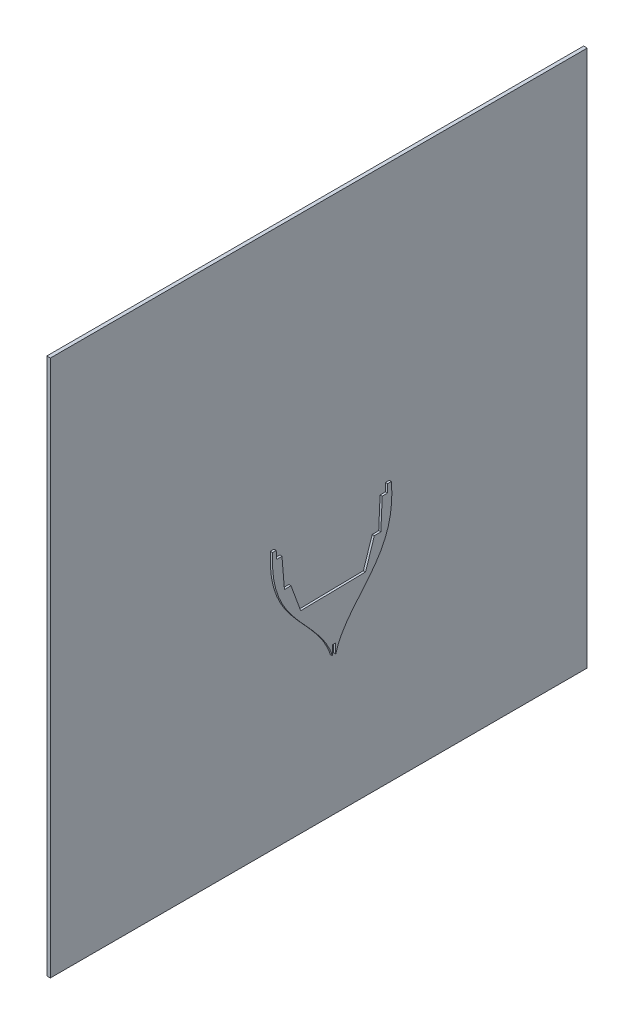
ISO-10303-21;
HEADER;
FILE_DESCRIPTION(('STEP AP214'),'2;1');
FILE_NAME('part.step','',(''),(''),'','','');
FILE_SCHEMA(('AUTOMOTIVE_DESIGN { 1 0 10303 214 1 1 1 1 }'));
ENDSEC;
DATA;
#1=APPLICATION_CONTEXT('core data for automotive mechanical design processes');
#2=APPLICATION_PROTOCOL_DEFINITION('international standard','automotive_design',2000,#1);
#3=PRODUCT_CONTEXT('',#1,'mechanical');
#4=PRODUCT('Part','Part','',(#3));
#5=PRODUCT_RELATED_PRODUCT_CATEGORY('part','',(#4));
#6=PRODUCT_DEFINITION_FORMATION('','',#4);
#7=PRODUCT_DEFINITION_CONTEXT('part definition',#1,'design');
#8=PRODUCT_DEFINITION('design','',#6,#7);
#9=PRODUCT_DEFINITION_SHAPE('','',#8);
#10=(LENGTH_UNIT() NAMED_UNIT(*) SI_UNIT(.MILLI.,.METRE.));
#11=(NAMED_UNIT(*) PLANE_ANGLE_UNIT() SI_UNIT($,.RADIAN.));
#12=(NAMED_UNIT(*) SI_UNIT($,.STERADIAN.) SOLID_ANGLE_UNIT());
#13=UNCERTAINTY_MEASURE_WITH_UNIT(LENGTH_MEASURE(1.E-05),#10,'distance_accuracy_value','');
#14=(GEOMETRIC_REPRESENTATION_CONTEXT(3) GLOBAL_UNCERTAINTY_ASSIGNED_CONTEXT((#13)) GLOBAL_UNIT_ASSIGNED_CONTEXT((#10,
#11,#12)) REPRESENTATION_CONTEXT('',''));
#15=CARTESIAN_POINT('',(0.,0.,0.));
#16=DIRECTION('',(0.,0.,1.));
#17=DIRECTION('',(1.,0.,0.));
#18=AXIS2_PLACEMENT_3D('',#15,#16,#17);
#19=CARTESIAN_POINT('',(6.,356.280633701159,172.379508382561));
#20=CARTESIAN_POINT('',(6.,148.736056380955,183.782555695277));
#21=CARTESIAN_POINT('',(6.,145.183117288321,33.5618458108781));
#22=CARTESIAN_POINT('',(6.,34.0320108089214,4.00706777772326));
#23=CARTESIAN_POINT('',(6.,0.,0.));
#24=B_SPLINE_CURVE_WITH_KNOTS('',4,(#19,#20,#21,#22,#23),.UNSPECIFIED.,.F.,.F.,(5,5),(0.,1.),.UNSPECIFIED.);
#25=DIRECTION('',(-1.,0.,0.));
#26=VECTOR('',#25,1.);
#27=SURFACE_OF_LINEAR_EXTRUSION('',#24,#26);
#28=CARTESIAN_POINT('',(0.,356.280633701159,172.379508382561));
#29=CARTESIAN_POINT('',(0.,148.736056380955,183.782555695277));
#30=CARTESIAN_POINT('',(0.,145.183117288321,33.5618458108781));
#31=CARTESIAN_POINT('',(0.,34.0320108089214,4.00706777772326));
#32=CARTESIAN_POINT('',(0.,0.,0.));
#33=B_SPLINE_CURVE_WITH_KNOTS('',4,(#28,#29,#30,#31,#32),.UNSPECIFIED.,.F.,.F.,(5,5),(0.,1.),.UNSPECIFIED.);
#34=CARTESIAN_POINT('',(0.,356.280633701159,172.379508382561));
#35=VERTEX_POINT('',#34);
#36=CARTESIAN_POINT('',(0.,22.4711291041874,4.90854973210714));
#37=VERTEX_POINT('',#36);
#38=EDGE_CURVE('E191',#35,#37,#33,.T.);
#39=ORIENTED_EDGE('',*,*,#38,.T.);
#40=DIRECTION('',(1.,0.,0.));
#41=VECTOR('',#40,1.);
#42=CARTESIAN_POINT('',(0.,22.4711291041874,4.90854973210714));
#43=LINE('',#42,#41);
#44=CARTESIAN_POINT('',(6.,22.4711291041874,4.90854973210714));
#45=VERTEX_POINT('',#44);
#46=EDGE_CURVE('E197',#37,#45,#43,.T.);
#47=ORIENTED_EDGE('',*,*,#46,.T.);
#48=CARTESIAN_POINT('',(6.,356.280633701159,172.379508382561));
#49=VERTEX_POINT('',#48);
#50=EDGE_CURVE('E231',#49,#45,#24,.T.);
#51=ORIENTED_EDGE('',*,*,#50,.F.);
#52=DIRECTION('',(-1.,0.,0.));
#53=VECTOR('',#52,1.);
#54=CARTESIAN_POINT('',(6.,356.280633701159,172.379508382561));
#55=LINE('',#54,#53);
#56=EDGE_CURVE('E187',#49,#35,#55,.T.);
#57=ORIENTED_EDGE('',*,*,#56,.T.);
#58=EDGE_LOOP('',(#39,#47,#51,#57));
#59=FACE_BOUND('',#58,.T.);
#60=ADVANCED_FACE('F45',(#59),#27,.F.);
#61=CARTESIAN_POINT('',(6.,0.,0.));
#62=CARTESIAN_POINT('',(6.,34.1548132396876,-2.77183773620876));
#63=CARTESIAN_POINT('',(6.,146.303432049568,-28.2814570046344));
#64=CARTESIAN_POINT('',(6.,155.294864157255,-178.274920872303));
#65=CARTESIAN_POINT('',(6.,362.290262173808,-159.362325518756));
#66=B_SPLINE_CURVE_WITH_KNOTS('',4,(#61,#62,#63,#64,#65),.UNSPECIFIED.,.F.,.F.,(5,5),(0.,1.),.UNSPECIFIED.);
#67=DIRECTION('',(-1.,0.,0.));
#68=VECTOR('',#67,1.);
#69=SURFACE_OF_LINEAR_EXTRUSION('',#66,#68);
#70=CARTESIAN_POINT('',(6.,22.6341674994895,-4.09145026789286));
#71=VERTEX_POINT('',#70);
#72=CARTESIAN_POINT('',(6.,362.290262173808,-159.362325518756));
#73=VERTEX_POINT('',#72);
#74=EDGE_CURVE('E128',#71,#73,#66,.T.);
#75=ORIENTED_EDGE('',*,*,#74,.F.);
#76=DIRECTION('',(1.,0.,0.));
#77=VECTOR('',#76,1.);
#78=CARTESIAN_POINT('',(0.,22.6341674994895,-4.09145026789286));
#79=LINE('',#78,#77);
#80=CARTESIAN_POINT('',(0.,22.6341674994895,-4.09145026789286));
#81=VERTEX_POINT('',#80);
#82=EDGE_CURVE('E323',#81,#71,#79,.T.);
#83=ORIENTED_EDGE('',*,*,#82,.F.);
#84=CARTESIAN_POINT('',(0.,0.,0.));
#85=CARTESIAN_POINT('',(0.,34.1548132396876,-2.77183773620876));
#86=CARTESIAN_POINT('',(0.,146.303432049568,-28.2814570046344));
#87=CARTESIAN_POINT('',(0.,155.294864157255,-178.274920872303));
#88=CARTESIAN_POINT('',(0.,362.290262173808,-159.362325518756));
#89=B_SPLINE_CURVE_WITH_KNOTS('',4,(#84,#85,#86,#87,#88),.UNSPECIFIED.,.F.,.F.,(5,5),(0.,1.),.UNSPECIFIED.);
#90=CARTESIAN_POINT('',(0.,362.290262173808,-159.362325518756));
#91=VERTEX_POINT('',#90);
#92=EDGE_CURVE('E196',#81,#91,#89,.T.);
#93=ORIENTED_EDGE('',*,*,#92,.T.);
#94=DIRECTION('',(-1.,0.,0.));
#95=VECTOR('',#94,1.);
#96=CARTESIAN_POINT('',(6.,362.290262173808,-159.362325518756));
#97=LINE('',#96,#95);
#98=EDGE_CURVE('E13',#73,#91,#97,.T.);
#99=ORIENTED_EDGE('',*,*,#98,.F.);
#100=EDGE_LOOP('',(#75,#83,#93,#99));
#101=FACE_BOUND('',#100,.T.);
#102=ADVANCED_FACE('F335',(#101),#69,.F.);
#103=CARTESIAN_POINT('',(6.,362.290262173808,-159.362325518756));
#104=DIRECTION('',(0.,-0.999835956927465,-0.0181124055536444));
#105=DIRECTION('',(0.,0.0181124055536444,-0.999835956927465));
#106=AXIS2_PLACEMENT_3D('',#103,#104,#105);
#107=PLANE('',#106);
#108=DIRECTION('',(0.,-0.0181124055536444,0.999835956927465));
#109=VECTOR('',#108,1.);
#110=CARTESIAN_POINT('',(0.,362.290262173808,-159.362325518756));
#111=LINE('',#110,#109);
#112=CARTESIAN_POINT('',(0.,362.10910840125,-149.362325518756));
#113=VERTEX_POINT('',#112);
#114=EDGE_CURVE('E204',#91,#113,#111,.T.);
#115=ORIENTED_EDGE('',*,*,#114,.T.);
#116=DIRECTION('',(-1.,0.,0.));
#117=VECTOR('',#116,1.);
#118=CARTESIAN_POINT('',(6.,362.10910840125,-149.362325518756));
#119=LINE('',#118,#117);
#120=CARTESIAN_POINT('',(6.,362.10910840125,-149.362325518756));
#121=VERTEX_POINT('',#120);
#122=EDGE_CURVE('E53',#121,#113,#119,.T.);
#123=ORIENTED_EDGE('',*,*,#122,.F.);
#124=DIRECTION('',(0.,-0.0181124055536444,0.999835956927465));
#125=VECTOR('',#124,1.);
#126=CARTESIAN_POINT('',(6.,362.290262173808,-159.362325518756));
#127=LINE('',#126,#125);
#128=EDGE_CURVE('E317',#73,#121,#127,.T.);
#129=ORIENTED_EDGE('',*,*,#128,.F.);
#130=ORIENTED_EDGE('',*,*,#98,.T.);
#131=EDGE_LOOP('',(#115,#123,#129,#130));
#132=FACE_BOUND('',#131,.T.);
#133=ADVANCED_FACE('F338',(#132),#107,.F.);
#134=CARTESIAN_POINT('',(6.,362.10910840125,-149.362325518756));
#135=DIRECTION('',(0.,-0.0391741395667259,-0.999232398788794));
#136=DIRECTION('',(0.,0.999232398788794,-0.039174139566726));
#137=AXIS2_PLACEMENT_3D('',#134,#135,#136);
#138=PLANE('',#137);
#139=DIRECTION('',(0.,-0.999232398788794,0.039174139566726));
#140=VECTOR('',#139,1.);
#141=CARTESIAN_POINT('',(0.,362.10910840125,-149.362325518756));
#142=LINE('',#141,#140);
#143=CARTESIAN_POINT('',(0.,339.534200842604,-148.477293587765));
#144=VERTEX_POINT('',#143);
#145=EDGE_CURVE('E209',#113,#144,#142,.T.);
#146=ORIENTED_EDGE('',*,*,#145,.T.);
#147=DIRECTION('',(-1.,0.,0.));
#148=VECTOR('',#147,1.);
#149=CARTESIAN_POINT('',(6.,339.534200842604,-148.477293587765));
#150=LINE('',#149,#148);
#151=CARTESIAN_POINT('',(6.,339.534200842604,-148.477293587765));
#152=VERTEX_POINT('',#151);
#153=EDGE_CURVE('E256',#152,#144,#150,.T.);
#154=ORIENTED_EDGE('',*,*,#153,.F.);
#155=DIRECTION('',(0.,-0.999232398788794,0.039174139566726));
#156=VECTOR('',#155,1.);
#157=CARTESIAN_POINT('',(6.,362.10910840125,-149.362325518756));
#158=LINE('',#157,#156);
#159=EDGE_CURVE('E265',#121,#152,#158,.T.);
#160=ORIENTED_EDGE('',*,*,#159,.F.);
#161=ORIENTED_EDGE('',*,*,#122,.T.);
#162=EDGE_LOOP('',(#146,#154,#160,#161));
#163=FACE_BOUND('',#162,.T.);
#164=ADVANCED_FACE('F263',(#163),#138,.F.);
#165=CARTESIAN_POINT('',(6.,339.534200842604,-148.477293587765));
#166=DIRECTION('',(0.,-0.999835956927465,-0.0181124055536422));
#167=DIRECTION('',(0.,0.0181124055536422,-0.999835956927466));
#168=AXIS2_PLACEMENT_3D('',#165,#166,#167);
#169=PLANE('',#168);
#170=DIRECTION('',(0.,-0.0181124055536422,0.999835956927466));
#171=VECTOR('',#170,1.);
#172=CARTESIAN_POINT('',(0.,339.534200842604,-148.477293587765));
#173=LINE('',#172,#171);
#174=CARTESIAN_POINT('',(0.,339.270932093817,-133.944405584924));
#175=VERTEX_POINT('',#174);
#176=EDGE_CURVE('E211',#144,#175,#173,.T.);
#177=ORIENTED_EDGE('',*,*,#176,.T.);
#178=DIRECTION('',(-1.,0.,0.));
#179=VECTOR('',#178,1.);
#180=CARTESIAN_POINT('',(6.,339.270932093817,-133.944405584924));
#181=LINE('',#180,#179);
#182=CARTESIAN_POINT('',(6.,339.270932093817,-133.944405584924));
#183=VERTEX_POINT('',#182);
#184=EDGE_CURVE('E253',#183,#175,#181,.T.);
#185=ORIENTED_EDGE('',*,*,#184,.F.);
#186=DIRECTION('',(0.,-0.0181124055536422,0.999835956927466));
#187=VECTOR('',#186,1.);
#188=CARTESIAN_POINT('',(6.,339.534200842604,-148.477293587765));
#189=LINE('',#188,#187);
#190=EDGE_CURVE('E287',#152,#183,#189,.T.);
#191=ORIENTED_EDGE('',*,*,#190,.F.);
#192=ORIENTED_EDGE('',*,*,#153,.T.);
#193=EDGE_LOOP('',(#177,#185,#191,#192));
#194=FACE_BOUND('',#193,.T.);
#195=ADVANCED_FACE('F278',(#194),#169,.F.);
#196=CARTESIAN_POINT('',(6.,339.270932093817,-133.944405584924));
#197=DIRECTION('',(0.,-0.0452782812916506,-0.998974412706989));
#198=DIRECTION('',(0.,0.998974412706989,-0.0452782812916506));
#199=AXIS2_PLACEMENT_3D('',#196,#197,#198);
#200=PLANE('',#199);
#201=DIRECTION('',(0.,-0.998974412706989,0.0452782812916506));
#202=VECTOR('',#201,1.);
#203=CARTESIAN_POINT('',(0.,339.270932093817,-133.944405584924));
#204=LINE('',#203,#202);
#205=CARTESIAN_POINT('',(0.,254.978494084232,-130.123870573808));
#206=VERTEX_POINT('',#205);
#207=EDGE_CURVE('E213',#175,#206,#204,.T.);
#208=ORIENTED_EDGE('',*,*,#207,.T.);
#209=DIRECTION('',(-1.,0.,0.));
#210=VECTOR('',#209,1.);
#211=CARTESIAN_POINT('',(6.,254.978494084232,-130.123870573808));
#212=LINE('',#211,#210);
#213=CARTESIAN_POINT('',(6.,254.978494084232,-130.123870573808));
#214=VERTEX_POINT('',#213);
#215=EDGE_CURVE('E250',#214,#206,#212,.T.);
#216=ORIENTED_EDGE('',*,*,#215,.F.);
#217=DIRECTION('',(0.,-0.998974412706989,0.0452782812916506));
#218=VECTOR('',#217,1.);
#219=CARTESIAN_POINT('',(6.,339.270932093817,-133.944405584924));
#220=LINE('',#219,#218);
#221=EDGE_CURVE('E284',#183,#214,#220,.T.);
#222=ORIENTED_EDGE('',*,*,#221,.F.);
#223=ORIENTED_EDGE('',*,*,#184,.T.);
#224=EDGE_LOOP('',(#208,#216,#222,#223));
#225=FACE_BOUND('',#224,.T.);
#226=ADVANCED_FACE('F282',(#225),#200,.F.);
#227=CARTESIAN_POINT('',(6.,254.978494084232,-130.123870573808));
#228=DIRECTION('',(0.,-0.999835956927465,-0.0181124055536477));
#229=DIRECTION('',(0.,0.0181124055536477,-0.999835956927465));
#230=AXIS2_PLACEMENT_3D('',#227,#228,#229);
#231=PLANE('',#230);
#232=DIRECTION('',(0.,-0.0181124055536477,0.999835956927465));
#233=VECTOR('',#232,1.);
#234=CARTESIAN_POINT('',(0.,254.978494084232,-130.123870573808));
#235=LINE('',#234,#233);
#236=CARTESIAN_POINT('',(0.,254.648375911079,-111.900779302144));
#237=VERTEX_POINT('',#236);
#238=EDGE_CURVE('E215',#206,#237,#235,.T.);
#239=ORIENTED_EDGE('',*,*,#238,.T.);
#240=DIRECTION('',(-1.,0.,0.));
#241=VECTOR('',#240,1.);
#242=CARTESIAN_POINT('',(6.,254.648375911079,-111.900779302144));
#243=LINE('',#242,#241);
#244=CARTESIAN_POINT('',(6.,254.648375911079,-111.900779302144));
#245=VERTEX_POINT('',#244);
#246=EDGE_CURVE('E247',#245,#237,#243,.T.);
#247=ORIENTED_EDGE('',*,*,#246,.F.);
#248=DIRECTION('',(0.,-0.0181124055536477,0.999835956927465));
#249=VECTOR('',#248,1.);
#250=CARTESIAN_POINT('',(6.,254.978494084232,-130.123870573808));
#251=LINE('',#250,#249);
#252=EDGE_CURVE('E286',#214,#245,#251,.T.);
#253=ORIENTED_EDGE('',*,*,#252,.F.);
#254=ORIENTED_EDGE('',*,*,#215,.T.);
#255=EDGE_LOOP('',(#239,#247,#253,#254));
#256=FACE_BOUND('',#255,.T.);
#257=ADVANCED_FACE('F348',(#256),#231,.F.);
#258=CARTESIAN_POINT('',(6.,254.648375911079,-111.900779302144));
#259=DIRECTION('',(0.,-0.310187541661781,-0.950675385711559));
#260=DIRECTION('',(0.,0.950675385711559,-0.310187541661781));
#261=AXIS2_PLACEMENT_3D('',#258,#259,#260);
#262=PLANE('',#261);
#263=DIRECTION('',(0.,-0.950675385711559,0.310187541661781));
#264=VECTOR('',#263,1.);
#265=CARTESIAN_POINT('',(0.,254.648375911079,-111.900779302144));
#266=LINE('',#265,#264);
#267=CARTESIAN_POINT('',(0.,179.44082544892,-87.361966640238));
#268=VERTEX_POINT('',#267);
#269=EDGE_CURVE('E217',#237,#268,#266,.T.);
#270=ORIENTED_EDGE('',*,*,#269,.T.);
#271=DIRECTION('',(-1.,0.,0.));
#272=VECTOR('',#271,1.);
#273=CARTESIAN_POINT('',(6.,179.44082544892,-87.361966640238));
#274=LINE('',#273,#272);
#275=CARTESIAN_POINT('',(6.,179.44082544892,-87.361966640238));
#276=VERTEX_POINT('',#275);
#277=EDGE_CURVE('E244',#276,#268,#274,.T.);
#278=ORIENTED_EDGE('',*,*,#277,.F.);
#279=DIRECTION('',(0.,-0.950675385711559,0.310187541661781));
#280=VECTOR('',#279,1.);
#281=CARTESIAN_POINT('',(6.,254.648375911079,-111.900779302144));
#282=LINE('',#281,#280);
#283=EDGE_CURVE('E289',#245,#276,#282,.T.);
#284=ORIENTED_EDGE('',*,*,#283,.F.);
#285=ORIENTED_EDGE('',*,*,#246,.T.);
#286=EDGE_LOOP('',(#270,#278,#284,#285));
#287=FACE_BOUND('',#286,.T.);
#288=ADVANCED_FACE('F351',(#287),#262,.F.);
#289=CARTESIAN_POINT('',(6.,179.44082544892,-87.361966640238));
#290=DIRECTION('',(0.,-0.999835956927465,-0.0181124055536431));
#291=DIRECTION('',(0.,0.0181124055536431,-0.999835956927466));
#292=AXIS2_PLACEMENT_3D('',#289,#290,#291);
#293=PLANE('',#292);
#294=DIRECTION('',(0.,-0.0181124055536431,0.999835956927465));
#295=VECTOR('',#294,1.);
#296=CARTESIAN_POINT('',(0.,179.44082544892,-87.361966640238));
#297=LINE('',#296,#295);
#298=CARTESIAN_POINT('',(0.,176.158939411901,93.8037905327611));
#299=VERTEX_POINT('',#298);
#300=EDGE_CURVE('E219',#268,#299,#297,.T.);
#301=ORIENTED_EDGE('',*,*,#300,.T.);
#302=DIRECTION('',(-1.,0.,0.));
#303=VECTOR('',#302,1.);
#304=CARTESIAN_POINT('',(6.,176.158939411901,93.8037905327611));
#305=LINE('',#304,#303);
#306=CARTESIAN_POINT('',(6.,176.158939411901,93.8037905327611));
#307=VERTEX_POINT('',#306);
#308=EDGE_CURVE('E241',#307,#299,#305,.T.);
#309=ORIENTED_EDGE('',*,*,#308,.F.);
#310=DIRECTION('',(0.,-0.0181124055536431,0.999835956927465));
#311=VECTOR('',#310,1.);
#312=CARTESIAN_POINT('',(6.,179.44082544892,-87.361966640238));
#313=LINE('',#312,#311);
#314=EDGE_CURVE('E295',#276,#307,#313,.T.);
#315=ORIENTED_EDGE('',*,*,#314,.F.);
#316=ORIENTED_EDGE('',*,*,#277,.T.);
#317=EDGE_LOOP('',(#301,#309,#315,#316));
#318=FACE_BOUND('',#317,.T.);
#319=ADVANCED_FACE('F355',(#318),#293,.F.);
#320=CARTESIAN_POINT('',(6.,250.428376777812,121.050435220232));
#321=DIRECTION('',(0.,-0.344416408837037,0.938816988195143));
#322=DIRECTION('',(0.,-0.938816988195143,-0.344416408837037));
#323=AXIS2_PLACEMENT_3D('',#320,#321,#322);
#324=PLANE('',#323);
#325=DIRECTION('',(0.,0.938816988195143,0.344416408837036));
#326=VECTOR('',#325,1.);
#327=CARTESIAN_POINT('',(0.,250.428376777812,121.050435220232));
#328=LINE('',#327,#326);
#329=CARTESIAN_POINT('',(0.,250.428376777812,121.050435220232));
#330=VERTEX_POINT('',#329);
#331=EDGE_CURVE('E221',#299,#330,#328,.T.);
#332=ORIENTED_EDGE('',*,*,#331,.T.);
#333=DIRECTION('',(-1.,0.,0.));
#334=VECTOR('',#333,1.);
#335=CARTESIAN_POINT('',(6.,250.428376777812,121.050435220232));
#336=LINE('',#335,#334);
#337=CARTESIAN_POINT('',(6.,250.428376777812,121.050435220232));
#338=VERTEX_POINT('',#337);
#339=EDGE_CURVE('E238',#338,#330,#336,.T.);
#340=ORIENTED_EDGE('',*,*,#339,.F.);
#341=DIRECTION('',(0.,0.938816988195143,0.344416408837036));
#342=VECTOR('',#341,1.);
#343=CARTESIAN_POINT('',(6.,250.428376777812,121.050435220232));
#344=LINE('',#343,#342);
#345=EDGE_CURVE('E297',#307,#338,#344,.T.);
#346=ORIENTED_EDGE('',*,*,#345,.F.);
#347=ORIENTED_EDGE('',*,*,#308,.T.);
#348=EDGE_LOOP('',(#332,#340,#346,#347));
#349=FACE_BOUND('',#348,.T.);
#350=ADVANCED_FACE('F359',(#349),#324,.F.);
#351=CARTESIAN_POINT('',(6.,250.098258604659,139.273526491895));
#352=DIRECTION('',(0.,-0.999835956927465,-0.0181124055536446));
#353=DIRECTION('',(0.,0.0181124055536446,-0.999835956927465));
#354=AXIS2_PLACEMENT_3D('',#351,#352,#353);
#355=PLANE('',#354);
#356=DIRECTION('',(0.,-0.0181124055536446,0.999835956927465));
#357=VECTOR('',#356,1.);
#358=CARTESIAN_POINT('',(0.,250.098258604659,139.273526491895));
#359=LINE('',#358,#357);
#360=CARTESIAN_POINT('',(0.,250.098258604659,139.273526491895));
#361=VERTEX_POINT('',#360);
#362=EDGE_CURVE('E223',#330,#361,#359,.T.);
#363=ORIENTED_EDGE('',*,*,#362,.T.);
#364=DIRECTION('',(-1.,0.,0.));
#365=VECTOR('',#364,1.);
#366=CARTESIAN_POINT('',(6.,250.098258604659,139.273526491895));
#367=LINE('',#366,#365);
#368=CARTESIAN_POINT('',(6.,250.098258604659,139.273526491895));
#369=VERTEX_POINT('',#368);
#370=EDGE_CURVE('E235',#369,#361,#367,.T.);
#371=ORIENTED_EDGE('',*,*,#370,.F.);
#372=DIRECTION('',(0.,-0.0181124055536446,0.999835956927465));
#373=VECTOR('',#372,1.);
#374=CARTESIAN_POINT('',(6.,250.098258604659,139.273526491895));
#375=LINE('',#374,#373);
#376=EDGE_CURVE('E299',#338,#369,#375,.T.);
#377=ORIENTED_EDGE('',*,*,#376,.F.);
#378=ORIENTED_EDGE('',*,*,#339,.T.);
#379=EDGE_LOOP('',(#363,#371,#377,#378));
#380=FACE_BOUND('',#379,.T.);
#381=ADVANCED_FACE('F305',(#380),#355,.F.);
#382=CARTESIAN_POINT('',(6.,334.197015332948,146.144531522241));
#383=DIRECTION('',(0.,-0.0814302964414967,0.996679039019809));
#384=DIRECTION('',(0.,-0.996679039019809,-0.0814302964414967));
#385=AXIS2_PLACEMENT_3D('',#382,#383,#384);
#386=PLANE('',#385);
#387=DIRECTION('',(0.,0.996679039019809,0.0814302964414967));
#388=VECTOR('',#387,1.);
#389=CARTESIAN_POINT('',(0.,334.197015332948,146.144531522241));
#390=LINE('',#389,#388);
#391=CARTESIAN_POINT('',(0.,334.197015332948,146.144531522241));
#392=VERTEX_POINT('',#391);
#393=EDGE_CURVE('E225',#361,#392,#390,.T.);
#394=ORIENTED_EDGE('',*,*,#393,.T.);
#395=DIRECTION('',(-1.,0.,0.));
#396=VECTOR('',#395,1.);
#397=CARTESIAN_POINT('',(6.,334.197015332948,146.144531522241));
#398=LINE('',#397,#396);
#399=CARTESIAN_POINT('',(6.,334.197015332948,146.144531522241));
#400=VERTEX_POINT('',#399);
#401=EDGE_CURVE('E182',#400,#392,#398,.T.);
#402=ORIENTED_EDGE('',*,*,#401,.F.);
#403=DIRECTION('',(0.,0.996679039019809,0.0814302964414967));
#404=VECTOR('',#403,1.);
#405=CARTESIAN_POINT('',(6.,334.197015332948,146.144531522241));
#406=LINE('',#405,#404);
#407=EDGE_CURVE('E170',#369,#400,#406,.T.);
#408=ORIENTED_EDGE('',*,*,#407,.F.);
#409=ORIENTED_EDGE('',*,*,#370,.T.);
#410=EDGE_LOOP('',(#394,#402,#408,#409));
#411=FACE_BOUND('',#410,.T.);
#412=ADVANCED_FACE('F309',(#411),#386,.F.);
#413=CARTESIAN_POINT('',(6.,333.93374658416,160.677419525082));
#414=DIRECTION('',(0.,-0.999835956927465,-0.0181124055536422));
#415=DIRECTION('',(0.,0.0181124055536422,-0.999835956927466));
#416=AXIS2_PLACEMENT_3D('',#413,#414,#415);
#417=PLANE('',#416);
#418=DIRECTION('',(0.,-0.0181124055536422,0.999835956927466));
#419=VECTOR('',#418,1.);
#420=CARTESIAN_POINT('',(0.,333.93374658416,160.677419525082));
#421=LINE('',#420,#419);
#422=CARTESIAN_POINT('',(0.,333.93374658416,160.677419525082));
#423=VERTEX_POINT('',#422);
#424=EDGE_CURVE('E179',#392,#423,#421,.T.);
#425=ORIENTED_EDGE('',*,*,#424,.T.);
#426=DIRECTION('',(-1.,0.,0.));
#427=VECTOR('',#426,1.);
#428=CARTESIAN_POINT('',(6.,333.93374658416,160.677419525082));
#429=LINE('',#428,#427);
#430=CARTESIAN_POINT('',(6.,333.93374658416,160.677419525082));
#431=VERTEX_POINT('',#430);
#432=EDGE_CURVE('E176',#431,#423,#429,.T.);
#433=ORIENTED_EDGE('',*,*,#432,.F.);
#434=DIRECTION('',(0.,-0.0181124055536422,0.999835956927466));
#435=VECTOR('',#434,1.);
#436=CARTESIAN_POINT('',(6.,333.93374658416,160.677419525082));
#437=LINE('',#436,#435);
#438=EDGE_CURVE('E163',#400,#431,#437,.T.);
#439=ORIENTED_EDGE('',*,*,#438,.F.);
#440=ORIENTED_EDGE('',*,*,#401,.T.);
#441=EDGE_LOOP('',(#425,#433,#439,#440));
#442=FACE_BOUND('',#441,.T.);
#443=ADVANCED_FACE('F177',(#442),#417,.F.);
#444=CARTESIAN_POINT('',(6.,356.461787473717,162.379508382561));
#445=DIRECTION('',(0.,-0.0753395037207183,0.997157940939707));
#446=DIRECTION('',(0.,-0.997157940939707,-0.0753395037207183));
#447=AXIS2_PLACEMENT_3D('',#444,#445,#446);
#448=PLANE('',#447);
#449=DIRECTION('',(0.,0.997157940939707,0.0753395037207183));
#450=VECTOR('',#449,1.);
#451=CARTESIAN_POINT('',(0.,356.461787473717,162.379508382561));
#452=LINE('',#451,#450);
#453=CARTESIAN_POINT('',(0.,356.461787473717,162.379508382561));
#454=VERTEX_POINT('',#453);
#455=EDGE_CURVE('E228',#423,#454,#452,.T.);
#456=ORIENTED_EDGE('',*,*,#455,.T.);
#457=DIRECTION('',(-1.,0.,0.));
#458=VECTOR('',#457,1.);
#459=CARTESIAN_POINT('',(6.,356.461787473717,162.379508382561));
#460=LINE('',#459,#458);
#461=CARTESIAN_POINT('',(6.,356.461787473717,162.379508382561));
#462=VERTEX_POINT('',#461);
#463=EDGE_CURVE('E183',#462,#454,#460,.T.);
#464=ORIENTED_EDGE('',*,*,#463,.F.);
#465=DIRECTION('',(0.,0.997157940939707,0.0753395037207183));
#466=VECTOR('',#465,1.);
#467=CARTESIAN_POINT('',(6.,356.461787473717,162.379508382561));
#468=LINE('',#467,#466);
#469=EDGE_CURVE('E167',#431,#462,#468,.T.);
#470=ORIENTED_EDGE('',*,*,#469,.F.);
#471=ORIENTED_EDGE('',*,*,#432,.T.);
#472=EDGE_LOOP('',(#456,#464,#470,#471));
#473=FACE_BOUND('',#472,.T.);
#474=ADVANCED_FACE('F185',(#473),#448,.F.);
#475=CARTESIAN_POINT('',(6.,356.280633701159,172.379508382561));
#476=DIRECTION('',(0.,-0.999835956927465,-0.0181124055536389));
#477=DIRECTION('',(0.,0.0181124055536389,-0.999835956927465));
#478=AXIS2_PLACEMENT_3D('',#475,#476,#477);
#479=PLANE('',#478);
#480=DIRECTION('',(0.,-0.0181124055536389,0.999835956927465));
#481=VECTOR('',#480,1.);
#482=CARTESIAN_POINT('',(0.,356.280633701159,172.379508382561));
#483=LINE('',#482,#481);
#484=EDGE_CURVE('E120',#454,#35,#483,.T.);
#485=ORIENTED_EDGE('',*,*,#484,.T.);
#486=ORIENTED_EDGE('',*,*,#56,.F.);
#487=DIRECTION('',(0.,-0.0181124055536389,0.999835956927465));
#488=VECTOR('',#487,1.);
#489=CARTESIAN_POINT('',(6.,356.280633701159,172.379508382561));
#490=LINE('',#489,#488);
#491=EDGE_CURVE('E69',#462,#49,#490,.T.);
#492=ORIENTED_EDGE('',*,*,#491,.F.);
#493=ORIENTED_EDGE('',*,*,#463,.T.);
#494=EDGE_LOOP('',(#485,#486,#492,#493));
#495=FACE_BOUND('',#494,.T.);
#496=ADVANCED_FACE('F311',(#495),#479,.F.);
#497=CARTESIAN_POINT('',(6.,122.403225386912,70.3068173212395));
#498=DIRECTION('',(-1.,0.,0.));
#499=DIRECTION('',(0.,0.,1.));
#500=AXIS2_PLACEMENT_3D('',#497,#498,#499);
#501=PLANE('',#500);
#502=ORIENTED_EDGE('',*,*,#50,.T.);
#503=DIRECTION('',(0.,-0.999835956927465,-0.0181124055536429));
#504=VECTOR('',#503,1.);
#505=CARTESIAN_POINT('',(6.,22.4711291041874,4.90854973210714));
#506=LINE('',#505,#504);
#507=CARTESIAN_POINT('',(6.,49.4711291041875,5.39766491801342));
#508=VERTEX_POINT('',#507);
#509=EDGE_CURVE('E511',#508,#45,#506,.T.);
#510=ORIENTED_EDGE('',*,*,#509,.F.);
#511=DIRECTION('',(0.,-0.0181124055536438,0.999835956927465));
#512=VECTOR('',#511,1.);
#513=CARTESIAN_POINT('',(6.,49.4711291041875,5.39766491801342));
#514=LINE('',#513,#512);
#515=CARTESIAN_POINT('',(6.,49.6341674994896,-3.60233508198658));
#516=VERTEX_POINT('',#515);
#517=EDGE_CURVE('E519',#516,#508,#514,.T.);
#518=ORIENTED_EDGE('',*,*,#517,.F.);
#519=DIRECTION('',(0.,0.999835956927465,0.0181124055536428));
#520=VECTOR('',#519,1.);
#521=CARTESIAN_POINT('',(6.,49.6341674994896,-3.60233508198658));
#522=LINE('',#521,#520);
#523=EDGE_CURVE('E523',#71,#516,#522,.T.);
#524=ORIENTED_EDGE('',*,*,#523,.F.);
#525=ORIENTED_EDGE('',*,*,#74,.T.);
#526=ORIENTED_EDGE('',*,*,#128,.T.);
#527=ORIENTED_EDGE('',*,*,#159,.T.);
#528=ORIENTED_EDGE('',*,*,#190,.T.);
#529=ORIENTED_EDGE('',*,*,#221,.T.);
#530=ORIENTED_EDGE('',*,*,#252,.T.);
#531=ORIENTED_EDGE('',*,*,#283,.T.);
#532=ORIENTED_EDGE('',*,*,#314,.T.);
#533=ORIENTED_EDGE('',*,*,#345,.T.);
#534=ORIENTED_EDGE('',*,*,#376,.T.);
#535=ORIENTED_EDGE('',*,*,#407,.T.);
#536=ORIENTED_EDGE('',*,*,#438,.T.);
#537=ORIENTED_EDGE('',*,*,#469,.T.);
#538=ORIENTED_EDGE('',*,*,#491,.T.);
#539=EDGE_LOOP('',(#502,#510,#518,#524,#525,#526,#527,#528,#529,#530,#531,#532,#533,#534,#535,
#536,#537,#538));
#540=FACE_BOUND('',#539,.T.);
#541=ADVANCED_FACE('F165',(#540),#501,.F.);
#542=CARTESIAN_POINT('',(0.,122.403225386912,70.3068173212395));
#543=DIRECTION('',(-1.,0.,0.));
#544=DIRECTION('',(0.,0.,1.));
#545=AXIS2_PLACEMENT_3D('',#542,#543,#544);
#546=PLANE('',#545);
#547=DIRECTION('',(0.,-0.999835956927465,-0.0181124055536429));
#548=VECTOR('',#547,1.);
#549=CARTESIAN_POINT('',(0.,22.4711291041874,4.90854973210714));
#550=LINE('',#549,#548);
#551=CARTESIAN_POINT('',(0.,49.4711291041875,5.39766491801342));
#552=VERTEX_POINT('',#551);
#553=EDGE_CURVE('E532',#552,#37,#550,.T.);
#554=ORIENTED_EDGE('',*,*,#553,.T.);
#555=ORIENTED_EDGE('',*,*,#38,.F.);
#556=ORIENTED_EDGE('',*,*,#484,.F.);
#557=ORIENTED_EDGE('',*,*,#455,.F.);
#558=ORIENTED_EDGE('',*,*,#424,.F.);
#559=ORIENTED_EDGE('',*,*,#393,.F.);
#560=ORIENTED_EDGE('',*,*,#362,.F.);
#561=ORIENTED_EDGE('',*,*,#331,.F.);
#562=ORIENTED_EDGE('',*,*,#300,.F.);
#563=ORIENTED_EDGE('',*,*,#269,.F.);
#564=ORIENTED_EDGE('',*,*,#238,.F.);
#565=ORIENTED_EDGE('',*,*,#207,.F.);
#566=ORIENTED_EDGE('',*,*,#176,.F.);
#567=ORIENTED_EDGE('',*,*,#145,.F.);
#568=ORIENTED_EDGE('',*,*,#114,.F.);
#569=ORIENTED_EDGE('',*,*,#92,.F.);
#570=DIRECTION('',(0.,0.999835956927465,0.0181124055536428));
#571=VECTOR('',#570,1.);
#572=CARTESIAN_POINT('',(0.,49.6341674994896,-3.60233508198658));
#573=LINE('',#572,#571);
#574=CARTESIAN_POINT('',(0.,49.6341674994896,-3.60233508198658));
#575=VERTEX_POINT('',#574);
#576=EDGE_CURVE('E518',#81,#575,#573,.T.);
#577=ORIENTED_EDGE('',*,*,#576,.T.);
#578=DIRECTION('',(0.,-0.0181124055536438,0.999835956927465));
#579=VECTOR('',#578,1.);
#580=CARTESIAN_POINT('',(0.,49.4711291041875,5.39766491801342));
#581=LINE('',#580,#579);
#582=EDGE_CURVE('E60',#575,#552,#581,.T.);
#583=ORIENTED_EDGE('',*,*,#582,.T.);
#584=EDGE_LOOP('',(#554,#555,#556,#557,#558,#559,#560,#561,#562,#563,#564,#565,#566,#567,#568,
#569,#577,#583));
#585=FACE_BOUND('',#584,.T.);
#586=ADVANCED_FACE('F272',(#585),#546,.T.);
#587=CARTESIAN_POINT('',(0.,22.4711291041874,4.90854973210714));
#588=DIRECTION('',(0.,-0.0181124055536429,0.999835956927465));
#589=DIRECTION('',(0.,-0.999835956927466,-0.0181124055536429));
#590=AXIS2_PLACEMENT_3D('',#587,#588,#589);
#591=PLANE('',#590);
#592=ORIENTED_EDGE('',*,*,#509,.T.);
#593=ORIENTED_EDGE('',*,*,#46,.F.);
#594=ORIENTED_EDGE('',*,*,#553,.F.);
#595=DIRECTION('',(1.,0.,0.));
#596=VECTOR('',#595,1.);
#597=CARTESIAN_POINT('',(0.,49.4711291041875,5.39766491801342));
#598=LINE('',#597,#596);
#599=EDGE_CURVE('E514',#552,#508,#598,.T.);
#600=ORIENTED_EDGE('',*,*,#599,.T.);
#601=EDGE_LOOP('',(#592,#593,#594,#600));
#602=FACE_BOUND('',#601,.T.);
#603=ADVANCED_FACE('F376',(#602),#591,.F.);
#604=CARTESIAN_POINT('',(0.,49.4711291041875,5.39766491801342));
#605=DIRECTION('',(0.,0.999835956927465,0.0181124055536438));
#606=DIRECTION('',(0.,-0.0181124055536438,0.999835956927466));
#607=AXIS2_PLACEMENT_3D('',#604,#605,#606);
#608=PLANE('',#607);
#609=ORIENTED_EDGE('',*,*,#517,.T.);
#610=ORIENTED_EDGE('',*,*,#599,.F.);
#611=ORIENTED_EDGE('',*,*,#582,.F.);
#612=DIRECTION('',(1.,0.,0.));
#613=VECTOR('',#612,1.);
#614=CARTESIAN_POINT('',(0.,49.6341674994896,-3.60233508198658));
#615=LINE('',#614,#613);
#616=EDGE_CURVE('E528',#575,#516,#615,.T.);
#617=ORIENTED_EDGE('',*,*,#616,.T.);
#618=EDGE_LOOP('',(#609,#610,#611,#617));
#619=FACE_BOUND('',#618,.T.);
#620=ADVANCED_FACE('F382',(#619),#608,.F.);
#621=CARTESIAN_POINT('',(0.,49.6341674994896,-3.60233508198658));
#622=DIRECTION('',(0.,0.0181124055536428,-0.999835956927465));
#623=DIRECTION('',(0.,0.999835956927466,0.0181124055536428));
#624=AXIS2_PLACEMENT_3D('',#621,#622,#623);
#625=PLANE('',#624);
#626=ORIENTED_EDGE('',*,*,#523,.T.);
#627=ORIENTED_EDGE('',*,*,#616,.F.);
#628=ORIENTED_EDGE('',*,*,#576,.F.);
#629=ORIENTED_EDGE('',*,*,#82,.T.);
#630=EDGE_LOOP('',(#626,#627,#628,#629));
#631=FACE_BOUND('',#630,.T.);
#632=ADVANCED_FACE('F379',(#631),#625,.F.);
#633=CLOSED_SHELL('',(#60,#102,#133,#164,#195,#226,#257,#288,#319,#350,#381,#412,#443,#474,#496,
#541,#586,#603,#620,#632));
#634=MANIFOLD_SOLID_BREP('B2',#633);
#635=CARTESIAN_POINT('',(-10.,0.,0.));
#636=DIRECTION('',(-1.,0.,0.));
#637=DIRECTION('',(0.,0.,1.));
#638=AXIS2_PLACEMENT_3D('',#635,#636,#637);
#639=PLANE('',#638);
#640=DIRECTION('',(0.,0.,-1.));
#641=VECTOR('',#640,1.);
#642=CARTESIAN_POINT('',(-10.,-378.710653275796,777.274991403029));
#643=LINE('',#642,#641);
#644=CARTESIAN_POINT('',(-10.,-378.710653275796,777.274991403029));
#645=VERTEX_POINT('',#644);
#646=CARTESIAN_POINT('',(-10.,-378.710653275796,-722.725008596971));
#647=VERTEX_POINT('',#646);
#648=EDGE_CURVE('E565',#645,#647,#643,.T.);
#649=ORIENTED_EDGE('',*,*,#648,.T.);
#650=DIRECTION('',(0.,-1.,0.));
#651=VECTOR('',#650,1.);
#652=CARTESIAN_POINT('',(-10.,1121.2893467242,-722.725008596971));
#653=LINE('',#652,#651);
#654=CARTESIAN_POINT('',(-10.,1121.2893467242,-722.725008596971));
#655=VERTEX_POINT('',#654);
#656=EDGE_CURVE('E599',#655,#647,#653,.T.);
#657=ORIENTED_EDGE('',*,*,#656,.F.);
#658=DIRECTION('',(0.,0.,-1.));
#659=VECTOR('',#658,1.);
#660=CARTESIAN_POINT('',(-10.,1121.2893467242,777.274991403029));
#661=LINE('',#660,#659);
#662=CARTESIAN_POINT('',(-10.,1121.2893467242,777.274991403029));
#663=VERTEX_POINT('',#662);
#664=EDGE_CURVE('E596',#663,#655,#661,.T.);
#665=ORIENTED_EDGE('',*,*,#664,.F.);
#666=DIRECTION('',(0.,-1.,0.));
#667=VECTOR('',#666,1.);
#668=CARTESIAN_POINT('',(-10.,1121.2893467242,777.274991403029));
#669=LINE('',#668,#667);
#670=EDGE_CURVE('E593',#663,#645,#669,.T.);
#671=ORIENTED_EDGE('',*,*,#670,.T.);
#672=EDGE_LOOP('',(#649,#657,#665,#671));
#673=FACE_BOUND('',#672,.T.);
#674=ADVANCED_FACE('F556',(#673),#639,.F.);
#675=CARTESIAN_POINT('',(-20.,0.,0.));
#676=DIRECTION('',(-1.,0.,0.));
#677=DIRECTION('',(0.,0.,1.));
#678=AXIS2_PLACEMENT_3D('',#675,#676,#677);
#679=PLANE('',#678);
#680=DIRECTION('',(0.,0.,-1.));
#681=VECTOR('',#680,1.);
#682=CARTESIAN_POINT('',(-20.,-378.710653275796,777.274991403029));
#683=LINE('',#682,#681);
#684=CARTESIAN_POINT('',(-20.,-378.710653275796,777.274991403029));
#685=VERTEX_POINT('',#684);
#686=CARTESIAN_POINT('',(-20.,-378.710653275796,-722.725008596971));
#687=VERTEX_POINT('',#686);
#688=EDGE_CURVE('E43',#685,#687,#683,.T.);
#689=ORIENTED_EDGE('',*,*,#688,.F.);
#690=DIRECTION('',(0.,-1.,0.));
#691=VECTOR('',#690,1.);
#692=CARTESIAN_POINT('',(-20.,1121.2893467242,777.274991403029));
#693=LINE('',#692,#691);
#694=CARTESIAN_POINT('',(-20.,1121.2893467242,777.274991403029));
#695=VERTEX_POINT('',#694);
#696=EDGE_CURVE('E612',#695,#685,#693,.T.);
#697=ORIENTED_EDGE('',*,*,#696,.F.);
#698=DIRECTION('',(0.,0.,-1.));
#699=VECTOR('',#698,1.);
#700=CARTESIAN_POINT('',(-20.,1121.2893467242,777.274991403029));
#701=LINE('',#700,#699);
#702=CARTESIAN_POINT('',(-20.,1121.2893467242,-722.725008596971));
#703=VERTEX_POINT('',#702);
#704=EDGE_CURVE('E603',#695,#703,#701,.T.);
#705=ORIENTED_EDGE('',*,*,#704,.T.);
#706=DIRECTION('',(0.,-1.,0.));
#707=VECTOR('',#706,1.);
#708=CARTESIAN_POINT('',(-20.,1121.2893467242,-722.725008596971));
#709=LINE('',#708,#707);
#710=EDGE_CURVE('E574',#703,#687,#709,.T.);
#711=ORIENTED_EDGE('',*,*,#710,.T.);
#712=EDGE_LOOP('',(#689,#697,#705,#711));
#713=FACE_BOUND('',#712,.T.);
#714=ADVANCED_FACE('F652',(#713),#679,.T.);
#715=CARTESIAN_POINT('',(-20.,1121.2893467242,777.274991403029));
#716=DIRECTION('',(0.,0.,1.));
#717=DIRECTION('',(1.,0.,0.));
#718=AXIS2_PLACEMENT_3D('',#715,#716,#717);
#719=PLANE('',#718);
#720=ORIENTED_EDGE('',*,*,#670,.F.);
#721=DIRECTION('',(1.,0.,0.));
#722=VECTOR('',#721,1.);
#723=CARTESIAN_POINT('',(-20.,1121.2893467242,777.274991403029));
#724=LINE('',#723,#722);
#725=EDGE_CURVE('E608',#695,#663,#724,.T.);
#726=ORIENTED_EDGE('',*,*,#725,.F.);
#727=ORIENTED_EDGE('',*,*,#696,.T.);
#728=DIRECTION('',(1.,0.,0.));
#729=VECTOR('',#728,1.);
#730=CARTESIAN_POINT('',(-20.,-378.710653275796,777.274991403029));
#731=LINE('',#730,#729);
#732=EDGE_CURVE('E604',#685,#645,#731,.T.);
#733=ORIENTED_EDGE('',*,*,#732,.T.);
#734=EDGE_LOOP('',(#720,#726,#727,#733));
#735=FACE_BOUND('',#734,.T.);
#736=ADVANCED_FACE('F613',(#735),#719,.T.);
#737=CARTESIAN_POINT('',(-20.,-378.710653275796,777.274991403029));
#738=DIRECTION('',(0.,-1.,0.));
#739=DIRECTION('',(0.,0.,-1.));
#740=AXIS2_PLACEMENT_3D('',#737,#738,#739);
#741=PLANE('',#740);
#742=ORIENTED_EDGE('',*,*,#648,.F.);
#743=ORIENTED_EDGE('',*,*,#732,.F.);
#744=ORIENTED_EDGE('',*,*,#688,.T.);
#745=DIRECTION('',(1.,0.,0.));
#746=VECTOR('',#745,1.);
#747=CARTESIAN_POINT('',(-20.,-378.710653275796,-722.725008596971));
#748=LINE('',#747,#746);
#749=EDGE_CURVE('E624',#687,#647,#748,.T.);
#750=ORIENTED_EDGE('',*,*,#749,.T.);
#751=EDGE_LOOP('',(#742,#743,#744,#750));
#752=FACE_BOUND('',#751,.T.);
#753=ADVANCED_FACE('F654',(#752),#741,.T.);
#754=CARTESIAN_POINT('',(-20.,1121.2893467242,777.274991403029));
#755=DIRECTION('',(0.,-1.,0.));
#756=DIRECTION('',(0.,0.,-1.));
#757=AXIS2_PLACEMENT_3D('',#754,#755,#756);
#758=PLANE('',#757);
#759=ORIENTED_EDGE('',*,*,#664,.T.);
#760=DIRECTION('',(1.,0.,0.));
#761=VECTOR('',#760,1.);
#762=CARTESIAN_POINT('',(-20.,1121.2893467242,-722.725008596971));
#763=LINE('',#762,#761);
#764=EDGE_CURVE('E628',#703,#655,#763,.T.);
#765=ORIENTED_EDGE('',*,*,#764,.F.);
#766=ORIENTED_EDGE('',*,*,#704,.F.);
#767=ORIENTED_EDGE('',*,*,#725,.T.);
#768=EDGE_LOOP('',(#759,#765,#766,#767));
#769=FACE_BOUND('',#768,.T.);
#770=ADVANCED_FACE('F609',(#769),#758,.F.);
#771=CARTESIAN_POINT('',(-20.,1121.2893467242,-722.725008596971));
#772=DIRECTION('',(0.,0.,1.));
#773=DIRECTION('',(1.,0.,0.));
#774=AXIS2_PLACEMENT_3D('',#771,#772,#773);
#775=PLANE('',#774);
#776=ORIENTED_EDGE('',*,*,#656,.T.);
#777=ORIENTED_EDGE('',*,*,#749,.F.);
#778=ORIENTED_EDGE('',*,*,#710,.F.);
#779=ORIENTED_EDGE('',*,*,#764,.T.);
#780=EDGE_LOOP('',(#776,#777,#778,#779));
#781=FACE_BOUND('',#780,.T.);
#782=ADVANCED_FACE('F639',(#781),#775,.F.);
#783=CLOSED_SHELL('',(#674,#714,#736,#753,#770,#782));
#784=MANIFOLD_SOLID_BREP('B7_NOT_SHOWN',#783);
#785=ADVANCED_BREP_SHAPE_REPRESENTATION('',(#18,#634,#784),#14);
#786=SHAPE_DEFINITION_REPRESENTATION(#9,#785);
ENDSEC;
END-ISO-10303-21;
